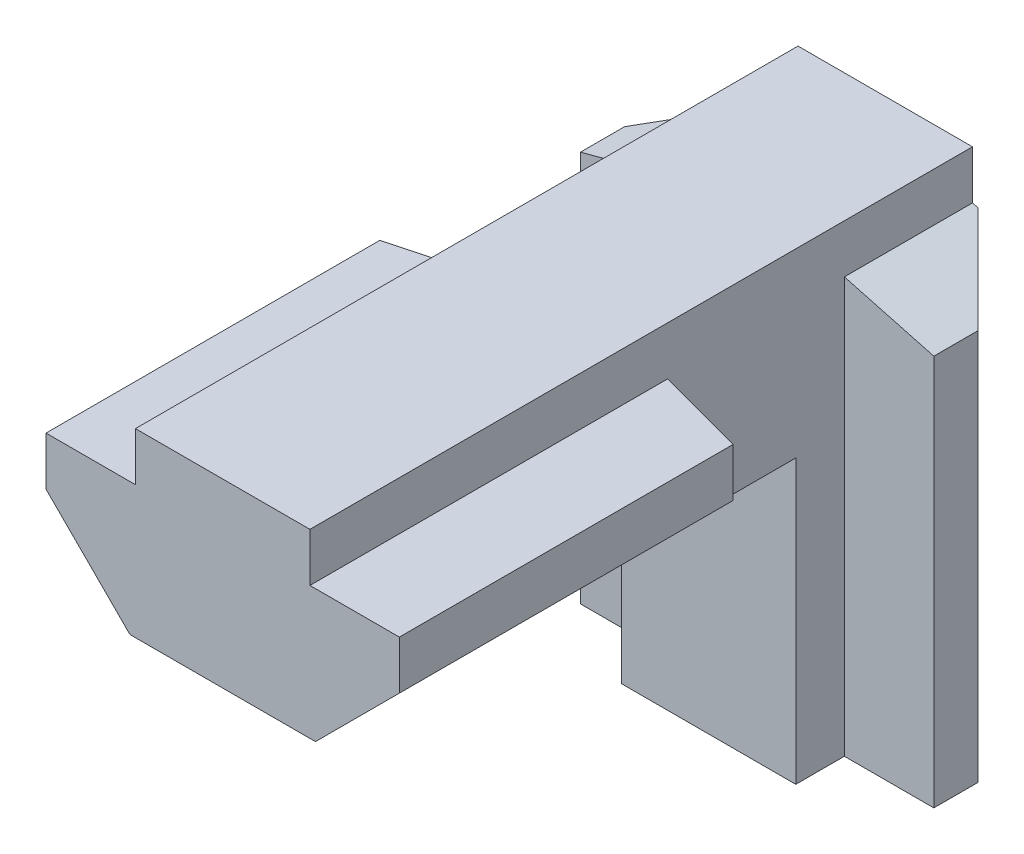
ISO-10303-21;
HEADER;
FILE_DESCRIPTION(('STEP AP214'),'2;1');
FILE_NAME('part.step','',(''),(''),'','','');
FILE_SCHEMA(('AUTOMOTIVE_DESIGN { 1 0 10303 214 1 1 1 1 }'));
ENDSEC;
DATA;
#1=APPLICATION_CONTEXT('core data for automotive mechanical design processes');
#2=APPLICATION_PROTOCOL_DEFINITION('international standard','automotive_design',2000,#1);
#3=PRODUCT_CONTEXT('',#1,'mechanical');
#4=PRODUCT('Part','Part','',(#3));
#5=PRODUCT_RELATED_PRODUCT_CATEGORY('part','',(#4));
#6=PRODUCT_DEFINITION_FORMATION('','',#4);
#7=PRODUCT_DEFINITION_CONTEXT('part definition',#1,'design');
#8=PRODUCT_DEFINITION('design','',#6,#7);
#9=PRODUCT_DEFINITION_SHAPE('','',#8);
#10=(LENGTH_UNIT() NAMED_UNIT(*) SI_UNIT(.MILLI.,.METRE.));
#11=(NAMED_UNIT(*) PLANE_ANGLE_UNIT() SI_UNIT($,.RADIAN.));
#12=(NAMED_UNIT(*) SI_UNIT($,.STERADIAN.) SOLID_ANGLE_UNIT());
#13=UNCERTAINTY_MEASURE_WITH_UNIT(LENGTH_MEASURE(1.E-05),#10,'distance_accuracy_value','');
#14=(GEOMETRIC_REPRESENTATION_CONTEXT(3) GLOBAL_UNCERTAINTY_ASSIGNED_CONTEXT((#13)) GLOBAL_UNIT_ASSIGNED_CONTEXT((#10,
#11,#12)) REPRESENTATION_CONTEXT('',''));
#15=CARTESIAN_POINT('',(0.,0.,0.));
#16=DIRECTION('',(0.,0.,1.));
#17=DIRECTION('',(1.,0.,0.));
#18=AXIS2_PLACEMENT_3D('',#15,#16,#17);
#19=CARTESIAN_POINT('',(8.,0.,0.));
#20=DIRECTION('',(1.,0.,0.));
#21=DIRECTION('',(0.,0.,-1.));
#22=AXIS2_PLACEMENT_3D('',#19,#20,#21);
#23=PLANE('',#22);
#24=DIRECTION('',(0.,1.,0.));
#25=VECTOR('',#24,1.);
#26=CARTESIAN_POINT('',(8.,-21.,-4.2));
#27=LINE('',#26,#25);
#28=CARTESIAN_POINT('',(8.,-21.,-4.2));
#29=VERTEX_POINT('',#28);
#30=CARTESIAN_POINT('',(8.,-3.285194229346,-4.2));
#31=VERTEX_POINT('',#30);
#32=EDGE_CURVE('E276',#29,#31,#27,.T.);
#33=ORIENTED_EDGE('',*,*,#32,.T.);
#34=DIRECTION('',(0.,0.,1.));
#35=VECTOR('',#34,1.);
#36=CARTESIAN_POINT('',(8.,-3.285194229346,-8.));
#37=LINE('',#36,#35);
#38=CARTESIAN_POINT('',(8.,-3.285194229346,-2.2));
#39=VERTEX_POINT('',#38);
#40=EDGE_CURVE('E244',#31,#39,#37,.T.);
#41=ORIENTED_EDGE('',*,*,#40,.T.);
#42=DIRECTION('',(0.,1.,0.));
#43=VECTOR('',#42,1.);
#44=CARTESIAN_POINT('',(8.,-21.,-2.2));
#45=LINE('',#44,#43);
#46=CARTESIAN_POINT('',(8.,-21.,-2.2));
#47=VERTEX_POINT('',#46);
#48=EDGE_CURVE('E249',#39,#47,#45,.F.);
#49=ORIENTED_EDGE('',*,*,#48,.T.);
#50=DIRECTION('',(0.,0.,-1.));
#51=VECTOR('',#50,1.);
#52=CARTESIAN_POINT('',(8.,-21.,0.));
#53=LINE('',#52,#51);
#54=EDGE_CURVE('E288',#29,#47,#53,.F.);
#55=ORIENTED_EDGE('',*,*,#54,.F.);
#56=EDGE_LOOP('',(#33,#41,#49,#55));
#57=FACE_BOUND('',#56,.T.);
#58=ADVANCED_FACE('F15',(#57),#23,.T.);
#59=CARTESIAN_POINT('',(-8.,0.,0.));
#60=DIRECTION('',(1.,0.,0.));
#61=DIRECTION('',(0.,0.,-1.));
#62=AXIS2_PLACEMENT_3D('',#59,#60,#61);
#63=PLANE('',#62);
#64=DIRECTION('',(0.,1.,0.));
#65=VECTOR('',#64,1.);
#66=CARTESIAN_POINT('',(-8.,-21.,-2.2));
#67=LINE('',#66,#65);
#68=CARTESIAN_POINT('',(-8.,-21.,-2.2));
#69=VERTEX_POINT('',#68);
#70=CARTESIAN_POINT('',(-8.00000000000001,-3.28519422934598,-2.2));
#71=VERTEX_POINT('',#70);
#72=EDGE_CURVE('E214',#69,#71,#67,.T.);
#73=ORIENTED_EDGE('',*,*,#72,.T.);
#74=DIRECTION('',(0.,0.,1.));
#75=VECTOR('',#74,1.);
#76=CARTESIAN_POINT('',(-8.00000000000002,-3.28519422934593,-8.));
#77=LINE('',#76,#75);
#78=CARTESIAN_POINT('',(-8.00000000000001,-3.28519422934598,-4.2));
#79=VERTEX_POINT('',#78);
#80=EDGE_CURVE('E181',#71,#79,#77,.F.);
#81=ORIENTED_EDGE('',*,*,#80,.T.);
#82=DIRECTION('',(0.,1.,0.));
#83=VECTOR('',#82,1.);
#84=CARTESIAN_POINT('',(-8.,-21.,-4.2));
#85=LINE('',#84,#83);
#86=CARTESIAN_POINT('',(-8.,-21.,-4.2));
#87=VERTEX_POINT('',#86);
#88=EDGE_CURVE('E177',#79,#87,#85,.F.);
#89=ORIENTED_EDGE('',*,*,#88,.T.);
#90=DIRECTION('',(0.,0.,-1.));
#91=VECTOR('',#90,1.);
#92=CARTESIAN_POINT('',(-8.,-21.,0.));
#93=LINE('',#92,#91);
#94=EDGE_CURVE('E217',#69,#87,#93,.T.);
#95=ORIENTED_EDGE('',*,*,#94,.F.);
#96=EDGE_LOOP('',(#73,#81,#89,#95));
#97=FACE_BOUND('',#96,.T.);
#98=ADVANCED_FACE('F216',(#97),#63,.F.);
#99=CARTESIAN_POINT('',(-8.,-21.,-2.2));
#100=DIRECTION('',(0.,0.,-1.));
#101=DIRECTION('',(-1.,0.,0.));
#102=AXIS2_PLACEMENT_3D('',#99,#100,#101);
#103=PLANE('',#102);
#104=DIRECTION('',(0.,1.,0.));
#105=VECTOR('',#104,1.);
#106=CARTESIAN_POINT('',(-3.95,-2.2,-2.2));
#107=LINE('',#106,#105);
#108=CARTESIAN_POINT('',(-3.95,-21.,-2.2));
#109=VERTEX_POINT('',#108);
#110=CARTESIAN_POINT('',(-3.95,-2.2,-2.2));
#111=VERTEX_POINT('',#110);
#112=EDGE_CURVE('E223',#109,#111,#107,.T.);
#113=ORIENTED_EDGE('',*,*,#112,.T.);
#114=DIRECTION('',(0.965925826289076,0.258819045102493,0.));
#115=VECTOR('',#114,1.);
#116=CARTESIAN_POINT('',(-3.95,-2.2,-2.2));
#117=LINE('',#116,#115);
#118=EDGE_CURVE('E220',#111,#71,#117,.F.);
#119=ORIENTED_EDGE('',*,*,#118,.T.);
#120=ORIENTED_EDGE('',*,*,#72,.F.);
#121=DIRECTION('',(1.,0.,0.));
#122=VECTOR('',#121,1.);
#123=CARTESIAN_POINT('',(-8.,-21.,-2.2));
#124=LINE('',#123,#122);
#125=EDGE_CURVE('E169',#109,#69,#124,.F.);
#126=ORIENTED_EDGE('',*,*,#125,.F.);
#127=EDGE_LOOP('',(#113,#119,#120,#126));
#128=FACE_BOUND('',#127,.T.);
#129=ADVANCED_FACE('F221',(#128),#103,.F.);
#130=CARTESIAN_POINT('',(-3.95,-2.2,-8.));
#131=DIRECTION('',(0.258819045102493,-0.965925826289076,0.));
#132=DIRECTION('',(0.965925826289076,0.258819045102493,0.));
#133=AXIS2_PLACEMENT_3D('',#130,#131,#132);
#134=PLANE('',#133);
#135=DIRECTION('',(0.,0.,-1.));
#136=VECTOR('',#135,1.);
#137=CARTESIAN_POINT('',(-3.95,-2.2,22.));
#138=LINE('',#137,#136);
#139=CARTESIAN_POINT('',(-3.95,-2.2,-8.));
#140=VERTEX_POINT('',#139);
#141=EDGE_CURVE('E306',#111,#140,#138,.T.);
#142=ORIENTED_EDGE('',*,*,#141,.T.);
#143=DIRECTION('',(0.965925826289076,0.258819045102493,0.));
#144=VECTOR('',#143,1.);
#145=CARTESIAN_POINT('',(-3.95,-2.2,-8.));
#146=LINE('',#145,#144);
#147=CARTESIAN_POINT('',(-4.20000000000003,-2.26698729810789,-8.));
#148=VERTEX_POINT('',#147);
#149=EDGE_CURVE('E76',#148,#140,#146,.T.);
#150=ORIENTED_EDGE('',*,*,#149,.F.);
#151=DIRECTION('',(-0.694746590606872,-0.186156787897339,0.694746590606872));
#152=VECTOR('',#151,1.);
#153=CARTESIAN_POINT('',(-4.2,-2.26698729810799,-8.));
#154=LINE('',#153,#152);
#155=EDGE_CURVE('E228',#148,#79,#154,.T.);
#156=ORIENTED_EDGE('',*,*,#155,.T.);
#157=ORIENTED_EDGE('',*,*,#80,.F.);
#158=ORIENTED_EDGE('',*,*,#118,.F.);
#159=EDGE_LOOP('',(#142,#150,#156,#157,#158));
#160=FACE_BOUND('',#159,.T.);
#161=ADVANCED_FACE('F227',(#160),#134,.F.);
#162=CARTESIAN_POINT('',(-3.95,-21.,5.8));
#163=DIRECTION('',(0.258819045102493,0.,0.965925826289076));
#164=DIRECTION('',(0.965925826289076,0.,-0.258819045102493));
#165=AXIS2_PLACEMENT_3D('',#162,#163,#164);
#166=PLANE('',#165);
#167=DIRECTION('',(0.,1.,0.));
#168=VECTOR('',#167,1.);
#169=CARTESIAN_POINT('',(-3.95,-2.2,5.8));
#170=LINE('',#169,#168);
#171=CARTESIAN_POINT('',(-3.95,-2.2,5.8));
#172=VERTEX_POINT('',#171);
#173=CARTESIAN_POINT('',(-3.95,-8.19999999999999,5.8));
#174=VERTEX_POINT('',#173);
#175=EDGE_CURVE('E302',#172,#174,#170,.F.);
#176=ORIENTED_EDGE('',*,*,#175,.T.);
#177=DIRECTION('',(0.965925826288855,0.,-0.258819045103315));
#178=VECTOR('',#177,1.);
#179=CARTESIAN_POINT('',(-4.2,-8.2,5.866987298108));
#180=LINE('',#179,#178);
#181=CARTESIAN_POINT('',(-4.20000000000003,-8.2,5.86698729810789));
#182=VERTEX_POINT('',#181);
#183=EDGE_CURVE('E251',#182,#174,#180,.T.);
#184=ORIENTED_EDGE('',*,*,#183,.F.);
#185=DIRECTION('',(-0.694746590606872,0.694746590606872,0.186156787897339));
#186=VECTOR('',#185,1.);
#187=CARTESIAN_POINT('',(-4.2,-8.2,5.86698729810799));
#188=LINE('',#187,#186);
#189=CARTESIAN_POINT('',(-8.00000000000001,-4.4,6.88519422934598));
#190=VERTEX_POINT('',#189);
#191=EDGE_CURVE('E238',#182,#190,#188,.T.);
#192=ORIENTED_EDGE('',*,*,#191,.T.);
#193=DIRECTION('',(0.,1.,0.));
#194=VECTOR('',#193,1.);
#195=CARTESIAN_POINT('',(-8.,0.,6.885194229346));
#196=LINE('',#195,#194);
#197=CARTESIAN_POINT('',(-8.00000000000001,-2.2,6.88519422934597));
#198=VERTEX_POINT('',#197);
#199=EDGE_CURVE('E233',#190,#198,#196,.T.);
#200=ORIENTED_EDGE('',*,*,#199,.T.);
#201=DIRECTION('',(0.965925826289071,0.,-0.258819045102511));
#202=VECTOR('',#201,1.);
#203=CARTESIAN_POINT('',(-8.,-2.2,6.885194229346));
#204=LINE('',#203,#202);
#205=EDGE_CURVE('E225',#198,#172,#204,.T.);
#206=ORIENTED_EDGE('',*,*,#205,.T.);
#207=EDGE_LOOP('',(#176,#184,#192,#200,#206));
#208=FACE_BOUND('',#207,.T.);
#209=ADVANCED_FACE('F396',(#208),#166,.F.);
#210=CARTESIAN_POINT('',(-8.,-2.2,22.));
#211=DIRECTION('',(0.,-1.,0.));
#212=DIRECTION('',(0.,0.,-1.));
#213=AXIS2_PLACEMENT_3D('',#210,#211,#212);
#214=PLANE('',#213);
#215=DIRECTION('',(1.,0.,0.));
#216=VECTOR('',#215,1.);
#217=CARTESIAN_POINT('',(-8.,-2.2,22.));
#218=LINE('',#217,#216);
#219=CARTESIAN_POINT('',(-3.95,-2.2,22.));
#220=VERTEX_POINT('',#219);
#221=CARTESIAN_POINT('',(-8.,-2.2,22.));
#222=VERTEX_POINT('',#221);
#223=EDGE_CURVE('E143',#220,#222,#218,.F.);
#224=ORIENTED_EDGE('',*,*,#223,.F.);
#225=DIRECTION('',(0.,0.,-1.));
#226=VECTOR('',#225,1.);
#227=CARTESIAN_POINT('',(-3.95,-2.2,22.));
#228=LINE('',#227,#226);
#229=EDGE_CURVE('E304',#220,#172,#228,.T.);
#230=ORIENTED_EDGE('',*,*,#229,.T.);
#231=ORIENTED_EDGE('',*,*,#205,.F.);
#232=DIRECTION('',(0.,0.,-1.));
#233=VECTOR('',#232,1.);
#234=CARTESIAN_POINT('',(-8.,-2.2,0.));
#235=LINE('',#234,#233);
#236=EDGE_CURVE('E234',#198,#222,#235,.F.);
#237=ORIENTED_EDGE('',*,*,#236,.T.);
#238=EDGE_LOOP('',(#224,#230,#231,#237));
#239=FACE_BOUND('',#238,.T.);
#240=ADVANCED_FACE('F399',(#239),#214,.F.);
#241=CARTESIAN_POINT('',(-8.,0.,0.));
#242=DIRECTION('',(1.,0.,0.));
#243=DIRECTION('',(0.,0.,-1.));
#244=AXIS2_PLACEMENT_3D('',#241,#242,#243);
#245=PLANE('',#244);
#246=ORIENTED_EDGE('',*,*,#236,.F.);
#247=ORIENTED_EDGE('',*,*,#199,.F.);
#248=DIRECTION('',(0.,0.,1.));
#249=VECTOR('',#248,1.);
#250=CARTESIAN_POINT('',(-8.,-4.4,22.));
#251=LINE('',#250,#249);
#252=CARTESIAN_POINT('',(-8.,-4.4,22.));
#253=VERTEX_POINT('',#252);
#254=EDGE_CURVE('E236',#190,#253,#251,.T.);
#255=ORIENTED_EDGE('',*,*,#254,.T.);
#256=DIRECTION('',(0.,1.,0.));
#257=VECTOR('',#256,1.);
#258=CARTESIAN_POINT('',(-8.,0.,22.));
#259=LINE('',#258,#257);
#260=EDGE_CURVE('E326',#222,#253,#259,.F.);
#261=ORIENTED_EDGE('',*,*,#260,.F.);
#262=EDGE_LOOP('',(#246,#247,#255,#261));
#263=FACE_BOUND('',#262,.T.);
#264=ADVANCED_FACE('F402',(#263),#245,.F.);
#265=CARTESIAN_POINT('',(-4.2,-8.2,22.));
#266=DIRECTION('',(0.707106781186548,0.707106781186548,0.));
#267=DIRECTION('',(-0.707106781186548,0.707106781186548,0.));
#268=AXIS2_PLACEMENT_3D('',#265,#266,#267);
#269=PLANE('',#268);
#270=DIRECTION('',(0.,0.,-1.));
#271=VECTOR('',#270,1.);
#272=CARTESIAN_POINT('',(-4.2,-8.2,22.));
#273=LINE('',#272,#271);
#274=CARTESIAN_POINT('',(-4.2,-8.2,22.));
#275=VERTEX_POINT('',#274);
#276=EDGE_CURVE('E253',#275,#182,#273,.T.);
#277=ORIENTED_EDGE('',*,*,#276,.F.);
#278=DIRECTION('',(0.707106781186548,-0.707106781186547,0.));
#279=VECTOR('',#278,1.);
#280=CARTESIAN_POINT('',(-8.,-4.4,22.));
#281=LINE('',#280,#279);
#282=EDGE_CURVE('E323',#253,#275,#281,.T.);
#283=ORIENTED_EDGE('',*,*,#282,.F.);
#284=ORIENTED_EDGE('',*,*,#254,.F.);
#285=ORIENTED_EDGE('',*,*,#191,.F.);
#286=EDGE_LOOP('',(#277,#283,#284,#285));
#287=FACE_BOUND('',#286,.T.);
#288=ADVANCED_FACE('F393',(#287),#269,.F.);
#289=CARTESIAN_POINT('',(8.,-4.4,22.));
#290=DIRECTION('',(-0.707106781186548,0.707106781186548,0.));
#291=DIRECTION('',(-0.707106781186548,-0.707106781186548,0.));
#292=AXIS2_PLACEMENT_3D('',#289,#290,#291);
#293=PLANE('',#292);
#294=DIRECTION('',(0.,0.,-1.));
#295=VECTOR('',#294,1.);
#296=CARTESIAN_POINT('',(4.2,-8.2,22.));
#297=LINE('',#296,#295);
#298=CARTESIAN_POINT('',(4.20000000000001,-8.2,5.86698729810796));
#299=VERTEX_POINT('',#298);
#300=CARTESIAN_POINT('',(4.2,-8.2,22.));
#301=VERTEX_POINT('',#300);
#302=EDGE_CURVE('E257',#299,#301,#297,.F.);
#303=ORIENTED_EDGE('',*,*,#302,.F.);
#304=DIRECTION('',(0.694746590606865,0.694746590606872,0.186156787897364));
#305=VECTOR('',#304,1.);
#306=CARTESIAN_POINT('',(4.20000000000004,-8.19999999999999,5.86698729810786));
#307=LINE('',#306,#305);
#308=CARTESIAN_POINT('',(8.,-4.4,6.885194229346));
#309=VERTEX_POINT('',#308);
#310=EDGE_CURVE('E264',#299,#309,#307,.T.);
#311=ORIENTED_EDGE('',*,*,#310,.T.);
#312=DIRECTION('',(0.,0.,-1.));
#313=VECTOR('',#312,1.);
#314=CARTESIAN_POINT('',(8.,-4.4,0.));
#315=LINE('',#314,#313);
#316=CARTESIAN_POINT('',(8.,-4.4,22.));
#317=VERTEX_POINT('',#316);
#318=EDGE_CURVE('E241',#317,#309,#315,.T.);
#319=ORIENTED_EDGE('',*,*,#318,.F.);
#320=DIRECTION('',(0.707106781186548,0.707106781186547,0.));
#321=VECTOR('',#320,1.);
#322=CARTESIAN_POINT('',(4.2,-8.2,22.));
#323=LINE('',#322,#321);
#324=EDGE_CURVE('E317',#301,#317,#323,.T.);
#325=ORIENTED_EDGE('',*,*,#324,.F.);
#326=EDGE_LOOP('',(#303,#311,#319,#325));
#327=FACE_BOUND('',#326,.T.);
#328=ADVANCED_FACE('F388',(#327),#293,.F.);
#329=CARTESIAN_POINT('',(8.,0.,0.));
#330=DIRECTION('',(1.,0.,0.));
#331=DIRECTION('',(0.,0.,-1.));
#332=AXIS2_PLACEMENT_3D('',#329,#330,#331);
#333=PLANE('',#332);
#334=DIRECTION('',(0.,1.,0.));
#335=VECTOR('',#334,1.);
#336=CARTESIAN_POINT('',(8.,0.,22.));
#337=LINE('',#336,#335);
#338=CARTESIAN_POINT('',(8.,-2.2,22.));
#339=VERTEX_POINT('',#338);
#340=EDGE_CURVE('E314',#317,#339,#337,.T.);
#341=ORIENTED_EDGE('',*,*,#340,.F.);
#342=ORIENTED_EDGE('',*,*,#318,.T.);
#343=DIRECTION('',(0.,1.,0.));
#344=VECTOR('',#343,1.);
#345=CARTESIAN_POINT('',(8.,-21.,6.885194229346));
#346=LINE('',#345,#344);
#347=CARTESIAN_POINT('',(8.,-2.2,6.885194229346));
#348=VERTEX_POINT('',#347);
#349=EDGE_CURVE('E256',#309,#348,#346,.T.);
#350=ORIENTED_EDGE('',*,*,#349,.T.);
#351=DIRECTION('',(0.,0.,-1.));
#352=VECTOR('',#351,1.);
#353=CARTESIAN_POINT('',(8.,-2.2,22.));
#354=LINE('',#353,#352);
#355=EDGE_CURVE('E121',#348,#339,#354,.F.);
#356=ORIENTED_EDGE('',*,*,#355,.T.);
#357=EDGE_LOOP('',(#341,#342,#350,#356));
#358=FACE_BOUND('',#357,.T.);
#359=ADVANCED_FACE('F386',(#358),#333,.T.);
#360=CARTESIAN_POINT('',(8.,-3.285194229346,-8.));
#361=DIRECTION('',(-0.258819045102493,-0.965925826289076,0.));
#362=DIRECTION('',(0.965925826289076,-0.258819045102493,0.));
#363=AXIS2_PLACEMENT_3D('',#360,#361,#362);
#364=PLANE('',#363);
#365=DIRECTION('',(0.965925826289076,-0.258819045102493,0.));
#366=VECTOR('',#365,1.);
#367=CARTESIAN_POINT('',(8.,-3.285194229346,-8.));
#368=LINE('',#367,#366);
#369=CARTESIAN_POINT('',(3.94999999999999,-2.20000000000003,-8.));
#370=VERTEX_POINT('',#369);
#371=CARTESIAN_POINT('',(4.20000000000002,-2.26698729810793,-8.));
#372=VERTEX_POINT('',#371);
#373=EDGE_CURVE('E245',#370,#372,#368,.T.);
#374=ORIENTED_EDGE('',*,*,#373,.F.);
#375=DIRECTION('',(0.,0.,1.));
#376=VECTOR('',#375,1.);
#377=CARTESIAN_POINT('',(3.95,-2.2,22.));
#378=LINE('',#377,#376);
#379=CARTESIAN_POINT('',(3.94999999999999,-2.20000000000004,-2.2));
#380=VERTEX_POINT('',#379);
#381=EDGE_CURVE('E113',#370,#380,#378,.T.);
#382=ORIENTED_EDGE('',*,*,#381,.T.);
#383=DIRECTION('',(0.965925826289071,-0.25881904510251,0.));
#384=VECTOR('',#383,1.);
#385=CARTESIAN_POINT('',(3.95,-2.2,-2.2));
#386=LINE('',#385,#384);
#387=EDGE_CURVE('E247',#380,#39,#386,.T.);
#388=ORIENTED_EDGE('',*,*,#387,.T.);
#389=ORIENTED_EDGE('',*,*,#40,.F.);
#390=DIRECTION('',(-0.694746590606872,0.186156787897339,-0.694746590606872));
#391=VECTOR('',#390,1.);
#392=CARTESIAN_POINT('',(8.,-3.28519422934599,-4.2));
#393=LINE('',#392,#391);
#394=EDGE_CURVE('E273',#31,#372,#393,.T.);
#395=ORIENTED_EDGE('',*,*,#394,.T.);
#396=EDGE_LOOP('',(#374,#382,#388,#389,#395));
#397=FACE_BOUND('',#396,.T.);
#398=ADVANCED_FACE('F446',(#397),#364,.F.);
#399=CARTESIAN_POINT('',(3.95,-21.,-2.2));
#400=DIRECTION('',(0.,0.,-1.));
#401=DIRECTION('',(-1.,0.,0.));
#402=AXIS2_PLACEMENT_3D('',#399,#400,#401);
#403=PLANE('',#402);
#404=DIRECTION('',(1.,0.,0.));
#405=VECTOR('',#404,1.);
#406=CARTESIAN_POINT('',(-8.,-21.,-2.2));
#407=LINE('',#406,#405);
#408=CARTESIAN_POINT('',(3.95,-21.,-2.2));
#409=VERTEX_POINT('',#408);
#410=EDGE_CURVE('E286',#47,#409,#407,.F.);
#411=ORIENTED_EDGE('',*,*,#410,.F.);
#412=ORIENTED_EDGE('',*,*,#48,.F.);
#413=ORIENTED_EDGE('',*,*,#387,.F.);
#414=DIRECTION('',(0.,1.,0.));
#415=VECTOR('',#414,1.);
#416=CARTESIAN_POINT('',(3.95,0.,-2.2));
#417=LINE('',#416,#415);
#418=EDGE_CURVE('E107',#380,#409,#417,.F.);
#419=ORIENTED_EDGE('',*,*,#418,.T.);
#420=EDGE_LOOP('',(#411,#412,#413,#419));
#421=FACE_BOUND('',#420,.T.);
#422=ADVANCED_FACE('F443',(#421),#403,.F.);
#423=CARTESIAN_POINT('',(-8.,-8.2,0.));
#424=DIRECTION('',(0.,0.,1.));
#425=DIRECTION('',(1.,0.,0.));
#426=AXIS2_PLACEMENT_3D('',#423,#424,#425);
#427=PLANE('',#426);
#428=DIRECTION('',(0.,1.,0.));
#429=VECTOR('',#428,1.);
#430=CARTESIAN_POINT('',(-3.95,-2.2,0.));
#431=LINE('',#430,#429);
#432=CARTESIAN_POINT('',(-3.95,-8.2,0.));
#433=VERTEX_POINT('',#432);
#434=CARTESIAN_POINT('',(-3.95,-21.,0.));
#435=VERTEX_POINT('',#434);
#436=EDGE_CURVE('E151',#433,#435,#431,.F.);
#437=ORIENTED_EDGE('',*,*,#436,.T.);
#438=DIRECTION('',(1.,0.,0.));
#439=VECTOR('',#438,1.);
#440=CARTESIAN_POINT('',(-8.,-21.,0.));
#441=LINE('',#440,#439);
#442=CARTESIAN_POINT('',(3.95,-21.,0.));
#443=VERTEX_POINT('',#442);
#444=EDGE_CURVE('E284',#443,#435,#441,.F.);
#445=ORIENTED_EDGE('',*,*,#444,.F.);
#446=DIRECTION('',(0.,1.,0.));
#447=VECTOR('',#446,1.);
#448=CARTESIAN_POINT('',(3.95,0.,0.));
#449=LINE('',#448,#447);
#450=CARTESIAN_POINT('',(3.95,-8.2,0.));
#451=VERTEX_POINT('',#450);
#452=EDGE_CURVE('E338',#443,#451,#449,.T.);
#453=ORIENTED_EDGE('',*,*,#452,.T.);
#454=DIRECTION('',(1.,0.,0.));
#455=VECTOR('',#454,1.);
#456=CARTESIAN_POINT('',(-8.,-8.2,0.));
#457=LINE('',#456,#455);
#458=EDGE_CURVE('E259',#433,#451,#457,.T.);
#459=ORIENTED_EDGE('',*,*,#458,.F.);
#460=EDGE_LOOP('',(#437,#445,#453,#459));
#461=FACE_BOUND('',#460,.T.);
#462=ADVANCED_FACE('F369',(#461),#427,.T.);
#463=CARTESIAN_POINT('',(-8.,-8.2,22.));
#464=DIRECTION('',(0.,-1.,0.));
#465=DIRECTION('',(0.,0.,-1.));
#466=AXIS2_PLACEMENT_3D('',#463,#464,#465);
#467=PLANE('',#466);
#468=DIRECTION('',(1.,0.,0.));
#469=VECTOR('',#468,1.);
#470=CARTESIAN_POINT('',(-8.,-8.2,22.));
#471=LINE('',#470,#469);
#472=EDGE_CURVE('E320',#275,#301,#471,.T.);
#473=ORIENTED_EDGE('',*,*,#472,.F.);
#474=ORIENTED_EDGE('',*,*,#276,.T.);
#475=ORIENTED_EDGE('',*,*,#183,.T.);
#476=DIRECTION('',(0.,0.,-1.));
#477=VECTOR('',#476,1.);
#478=CARTESIAN_POINT('',(-3.95,-8.2,22.));
#479=LINE('',#478,#477);
#480=EDGE_CURVE('E299',#174,#433,#479,.T.);
#481=ORIENTED_EDGE('',*,*,#480,.T.);
#482=ORIENTED_EDGE('',*,*,#458,.T.);
#483=DIRECTION('',(0.,0.,1.));
#484=VECTOR('',#483,1.);
#485=CARTESIAN_POINT('',(3.95,-8.2,22.));
#486=LINE('',#485,#484);
#487=CARTESIAN_POINT('',(3.95,-8.2,5.80000000000001));
#488=VERTEX_POINT('',#487);
#489=EDGE_CURVE('E336',#451,#488,#486,.T.);
#490=ORIENTED_EDGE('',*,*,#489,.T.);
#491=DIRECTION('',(0.965925826289076,0.,0.258819045102493));
#492=VECTOR('',#491,1.);
#493=CARTESIAN_POINT('',(8.,-8.19999999999999,6.885194229346));
#494=LINE('',#493,#492);
#495=EDGE_CURVE('E268',#488,#299,#494,.T.);
#496=ORIENTED_EDGE('',*,*,#495,.T.);
#497=ORIENTED_EDGE('',*,*,#302,.T.);
#498=EDGE_LOOP('',(#473,#474,#475,#481,#482,#490,#496,#497));
#499=FACE_BOUND('',#498,.T.);
#500=ADVANCED_FACE('F373',(#499),#467,.T.);
#501=CARTESIAN_POINT('',(8.,-21.,6.885194229346));
#502=DIRECTION('',(-0.258819045102493,0.,0.965925826289076));
#503=DIRECTION('',(0.965925826289076,0.,0.258819045102493));
#504=AXIS2_PLACEMENT_3D('',#501,#502,#503);
#505=PLANE('',#504);
#506=ORIENTED_EDGE('',*,*,#495,.F.);
#507=DIRECTION('',(0.,1.,0.));
#508=VECTOR('',#507,1.);
#509=CARTESIAN_POINT('',(3.95,0.,5.8));
#510=LINE('',#509,#508);
#511=CARTESIAN_POINT('',(3.94999999999999,-2.2,5.80000000000004));
#512=VERTEX_POINT('',#511);
#513=EDGE_CURVE('E334',#488,#512,#510,.T.);
#514=ORIENTED_EDGE('',*,*,#513,.T.);
#515=DIRECTION('',(0.965925826289071,0.,0.258819045102511));
#516=VECTOR('',#515,1.);
#517=CARTESIAN_POINT('',(3.95,-2.2,5.8));
#518=LINE('',#517,#516);
#519=EDGE_CURVE('E267',#512,#348,#518,.T.);
#520=ORIENTED_EDGE('',*,*,#519,.T.);
#521=ORIENTED_EDGE('',*,*,#349,.F.);
#522=ORIENTED_EDGE('',*,*,#310,.F.);
#523=EDGE_LOOP('',(#506,#514,#520,#521,#522));
#524=FACE_BOUND('',#523,.T.);
#525=ADVANCED_FACE('F379',(#524),#505,.F.);
#526=CARTESIAN_POINT('',(3.95,-2.2,22.));
#527=DIRECTION('',(0.,-1.,0.));
#528=DIRECTION('',(0.,0.,-1.));
#529=AXIS2_PLACEMENT_3D('',#526,#527,#528);
#530=PLANE('',#529);
#531=DIRECTION('',(1.,0.,0.));
#532=VECTOR('',#531,1.);
#533=CARTESIAN_POINT('',(-8.,-2.2,22.));
#534=LINE('',#533,#532);
#535=CARTESIAN_POINT('',(3.95,-2.2,22.));
#536=VERTEX_POINT('',#535);
#537=EDGE_CURVE('E312',#339,#536,#534,.F.);
#538=ORIENTED_EDGE('',*,*,#537,.F.);
#539=ORIENTED_EDGE('',*,*,#355,.F.);
#540=ORIENTED_EDGE('',*,*,#519,.F.);
#541=DIRECTION('',(0.,0.,1.));
#542=VECTOR('',#541,1.);
#543=CARTESIAN_POINT('',(3.95,-2.2,22.));
#544=LINE('',#543,#542);
#545=EDGE_CURVE('E85',#512,#536,#544,.T.);
#546=ORIENTED_EDGE('',*,*,#545,.T.);
#547=EDGE_LOOP('',(#538,#539,#540,#546));
#548=FACE_BOUND('',#547,.T.);
#549=ADVANCED_FACE('F382',(#548),#530,.F.);
#550=CARTESIAN_POINT('',(8.,-21.,-4.2));
#551=DIRECTION('',(-0.707106781186548,0.,0.707106781186548));
#552=DIRECTION('',(0.707106781186548,0.,0.707106781186548));
#553=AXIS2_PLACEMENT_3D('',#550,#551,#552);
#554=PLANE('',#553);
#555=DIRECTION('',(0.707106781186547,0.,0.707106781186547));
#556=VECTOR('',#555,1.);
#557=CARTESIAN_POINT('',(4.2,-21.,-8.));
#558=LINE('',#557,#556);
#559=CARTESIAN_POINT('',(4.2,-21.,-8.));
#560=VERTEX_POINT('',#559);
#561=EDGE_CURVE('E279',#560,#29,#558,.T.);
#562=ORIENTED_EDGE('',*,*,#561,.F.);
#563=DIRECTION('',(0.,1.,0.));
#564=VECTOR('',#563,1.);
#565=CARTESIAN_POINT('',(4.2,-21.,-8.));
#566=LINE('',#565,#564);
#567=EDGE_CURVE('E351',#372,#560,#566,.F.);
#568=ORIENTED_EDGE('',*,*,#567,.F.);
#569=ORIENTED_EDGE('',*,*,#394,.F.);
#570=ORIENTED_EDGE('',*,*,#32,.F.);
#571=EDGE_LOOP('',(#562,#568,#569,#570));
#572=FACE_BOUND('',#571,.T.);
#573=ADVANCED_FACE('F431',(#572),#554,.F.);
#574=CARTESIAN_POINT('',(-8.,-21.,0.));
#575=DIRECTION('',(0.,-1.,0.));
#576=DIRECTION('',(0.,0.,-1.));
#577=AXIS2_PLACEMENT_3D('',#574,#575,#576);
#578=PLANE('',#577);
#579=ORIENTED_EDGE('',*,*,#94,.T.);
#580=DIRECTION('',(0.707106781186548,0.,-0.707106781186548));
#581=VECTOR('',#580,1.);
#582=CARTESIAN_POINT('',(-4.2,-21.,-8.));
#583=LINE('',#582,#581);
#584=CARTESIAN_POINT('',(-4.2,-21.,-8.));
#585=VERTEX_POINT('',#584);
#586=EDGE_CURVE('E56',#87,#585,#583,.T.);
#587=ORIENTED_EDGE('',*,*,#586,.T.);
#588=DIRECTION('',(-1.,0.,0.));
#589=VECTOR('',#588,1.);
#590=CARTESIAN_POINT('',(-8.,-21.,-8.));
#591=LINE('',#590,#589);
#592=EDGE_CURVE('E348',#560,#585,#591,.T.);
#593=ORIENTED_EDGE('',*,*,#592,.F.);
#594=ORIENTED_EDGE('',*,*,#561,.T.);
#595=ORIENTED_EDGE('',*,*,#54,.T.);
#596=ORIENTED_EDGE('',*,*,#410,.T.);
#597=DIRECTION('',(0.,0.,1.));
#598=VECTOR('',#597,1.);
#599=CARTESIAN_POINT('',(3.95,-21.,22.));
#600=LINE('',#599,#598);
#601=EDGE_CURVE('E340',#409,#443,#600,.T.);
#602=ORIENTED_EDGE('',*,*,#601,.T.);
#603=ORIENTED_EDGE('',*,*,#444,.T.);
#604=DIRECTION('',(0.,0.,-1.));
#605=VECTOR('',#604,1.);
#606=CARTESIAN_POINT('',(-3.95,-21.,22.));
#607=LINE('',#606,#605);
#608=EDGE_CURVE('E296',#435,#109,#607,.T.);
#609=ORIENTED_EDGE('',*,*,#608,.T.);
#610=ORIENTED_EDGE('',*,*,#125,.T.);
#611=EDGE_LOOP('',(#579,#587,#593,#594,#595,#596,#602,#603,#609,#610));
#612=FACE_BOUND('',#611,.T.);
#613=ADVANCED_FACE('F366',(#612),#578,.T.);
#614=CARTESIAN_POINT('',(-4.2,-21.,-8.));
#615=DIRECTION('',(0.707106781186548,0.,0.707106781186548));
#616=DIRECTION('',(0.707106781186548,0.,-0.707106781186548));
#617=AXIS2_PLACEMENT_3D('',#614,#615,#616);
#618=PLANE('',#617);
#619=DIRECTION('',(0.,1.,0.));
#620=VECTOR('',#619,1.);
#621=CARTESIAN_POINT('',(-4.2,-21.,-8.));
#622=LINE('',#621,#620);
#623=EDGE_CURVE('E345',#585,#148,#622,.T.);
#624=ORIENTED_EDGE('',*,*,#623,.F.);
#625=ORIENTED_EDGE('',*,*,#586,.F.);
#626=ORIENTED_EDGE('',*,*,#88,.F.);
#627=ORIENTED_EDGE('',*,*,#155,.F.);
#628=EDGE_LOOP('',(#624,#625,#626,#627));
#629=FACE_BOUND('',#628,.T.);
#630=ADVANCED_FACE('F425',(#629),#618,.F.);
#631=CARTESIAN_POINT('',(-3.95,-2.2,22.));
#632=DIRECTION('',(1.,0.,0.));
#633=DIRECTION('',(0.,0.,-1.));
#634=AXIS2_PLACEMENT_3D('',#631,#632,#633);
#635=PLANE('',#634);
#636=ORIENTED_EDGE('',*,*,#436,.F.);
#637=ORIENTED_EDGE('',*,*,#480,.F.);
#638=ORIENTED_EDGE('',*,*,#175,.F.);
#639=ORIENTED_EDGE('',*,*,#229,.F.);
#640=DIRECTION('',(0.,1.,0.));
#641=VECTOR('',#640,1.);
#642=CARTESIAN_POINT('',(-3.95,0.,22.));
#643=LINE('',#642,#641);
#644=CARTESIAN_POINT('',(-3.95,0.,22.));
#645=VERTEX_POINT('',#644);
#646=EDGE_CURVE('E309',#645,#220,#643,.F.);
#647=ORIENTED_EDGE('',*,*,#646,.F.);
#648=DIRECTION('',(0.,0.,1.));
#649=VECTOR('',#648,1.);
#650=CARTESIAN_POINT('',(-3.95,0.,-8.));
#651=LINE('',#650,#649);
#652=CARTESIAN_POINT('',(-3.95,0.,-8.));
#653=VERTEX_POINT('',#652);
#654=EDGE_CURVE('E19',#653,#645,#651,.T.);
#655=ORIENTED_EDGE('',*,*,#654,.F.);
#656=DIRECTION('',(0.,1.,0.));
#657=VECTOR('',#656,1.);
#658=CARTESIAN_POINT('',(-3.95,-21.,-8.));
#659=LINE('',#658,#657);
#660=EDGE_CURVE('E332',#140,#653,#659,.T.);
#661=ORIENTED_EDGE('',*,*,#660,.F.);
#662=ORIENTED_EDGE('',*,*,#141,.F.);
#663=ORIENTED_EDGE('',*,*,#112,.F.);
#664=ORIENTED_EDGE('',*,*,#608,.F.);
#665=EDGE_LOOP('',(#636,#637,#638,#639,#647,#655,#661,#662,#663,#664));
#666=FACE_BOUND('',#665,.T.);
#667=ADVANCED_FACE('F363',(#666),#635,.F.);
#668=CARTESIAN_POINT('',(-8.,0.,22.));
#669=DIRECTION('',(0.,0.,1.));
#670=DIRECTION('',(1.,0.,0.));
#671=AXIS2_PLACEMENT_3D('',#668,#669,#670);
#672=PLANE('',#671);
#673=DIRECTION('',(1.,0.,0.));
#674=VECTOR('',#673,1.);
#675=CARTESIAN_POINT('',(-8.,0.,22.));
#676=LINE('',#675,#674);
#677=CARTESIAN_POINT('',(3.95,0.,22.));
#678=VERTEX_POINT('',#677);
#679=EDGE_CURVE('E357',#645,#678,#676,.T.);
#680=ORIENTED_EDGE('',*,*,#679,.F.);
#681=ORIENTED_EDGE('',*,*,#646,.T.);
#682=ORIENTED_EDGE('',*,*,#223,.T.);
#683=ORIENTED_EDGE('',*,*,#260,.T.);
#684=ORIENTED_EDGE('',*,*,#282,.T.);
#685=ORIENTED_EDGE('',*,*,#472,.T.);
#686=ORIENTED_EDGE('',*,*,#324,.T.);
#687=ORIENTED_EDGE('',*,*,#340,.T.);
#688=ORIENTED_EDGE('',*,*,#537,.T.);
#689=DIRECTION('',(0.,1.,0.));
#690=VECTOR('',#689,1.);
#691=CARTESIAN_POINT('',(3.95,0.,22.));
#692=LINE('',#691,#690);
#693=EDGE_CURVE('E330',#536,#678,#692,.T.);
#694=ORIENTED_EDGE('',*,*,#693,.T.);
#695=EDGE_LOOP('',(#680,#681,#682,#683,#684,#685,#686,#687,#688,#694));
#696=FACE_BOUND('',#695,.T.);
#697=ADVANCED_FACE('F384',(#696),#672,.T.);
#698=CARTESIAN_POINT('',(3.95,0.,22.));
#699=DIRECTION('',(-1.,0.,0.));
#700=DIRECTION('',(0.,0.,1.));
#701=AXIS2_PLACEMENT_3D('',#698,#699,#700);
#702=PLANE('',#701);
#703=ORIENTED_EDGE('',*,*,#545,.F.);
#704=ORIENTED_EDGE('',*,*,#513,.F.);
#705=ORIENTED_EDGE('',*,*,#489,.F.);
#706=ORIENTED_EDGE('',*,*,#452,.F.);
#707=ORIENTED_EDGE('',*,*,#601,.F.);
#708=ORIENTED_EDGE('',*,*,#418,.F.);
#709=ORIENTED_EDGE('',*,*,#381,.F.);
#710=DIRECTION('',(0.,1.,0.));
#711=VECTOR('',#710,1.);
#712=CARTESIAN_POINT('',(3.95,-21.,-8.));
#713=LINE('',#712,#711);
#714=CARTESIAN_POINT('',(3.95,0.,-8.));
#715=VERTEX_POINT('',#714);
#716=EDGE_CURVE('E34',#715,#370,#713,.F.);
#717=ORIENTED_EDGE('',*,*,#716,.F.);
#718=DIRECTION('',(0.,0.,1.));
#719=VECTOR('',#718,1.);
#720=CARTESIAN_POINT('',(3.95,0.,-8.));
#721=LINE('',#720,#719);
#722=EDGE_CURVE('E25',#678,#715,#721,.F.);
#723=ORIENTED_EDGE('',*,*,#722,.F.);
#724=ORIENTED_EDGE('',*,*,#693,.F.);
#725=EDGE_LOOP('',(#703,#704,#705,#706,#707,#708,#709,#717,#723,#724));
#726=FACE_BOUND('',#725,.T.);
#727=ADVANCED_FACE('F376',(#726),#702,.F.);
#728=CARTESIAN_POINT('',(-8.,-21.,-8.));
#729=DIRECTION('',(0.,0.,-1.));
#730=DIRECTION('',(-1.,0.,0.));
#731=AXIS2_PLACEMENT_3D('',#728,#729,#730);
#732=PLANE('',#731);
#733=ORIENTED_EDGE('',*,*,#592,.T.);
#734=ORIENTED_EDGE('',*,*,#623,.T.);
#735=ORIENTED_EDGE('',*,*,#149,.T.);
#736=ORIENTED_EDGE('',*,*,#660,.T.);
#737=DIRECTION('',(1.,0.,0.));
#738=VECTOR('',#737,1.);
#739=CARTESIAN_POINT('',(-8.,0.,-8.));
#740=LINE('',#739,#738);
#741=EDGE_CURVE('E9',#715,#653,#740,.F.);
#742=ORIENTED_EDGE('',*,*,#741,.F.);
#743=ORIENTED_EDGE('',*,*,#716,.T.);
#744=ORIENTED_EDGE('',*,*,#373,.T.);
#745=ORIENTED_EDGE('',*,*,#567,.T.);
#746=EDGE_LOOP('',(#733,#734,#735,#736,#742,#743,#744,#745));
#747=FACE_BOUND('',#746,.T.);
#748=ADVANCED_FACE('F362',(#747),#732,.T.);
#749=CARTESIAN_POINT('',(-8.,0.,-8.));
#750=DIRECTION('',(0.,1.,0.));
#751=DIRECTION('',(0.,0.,1.));
#752=AXIS2_PLACEMENT_3D('',#749,#750,#751);
#753=PLANE('',#752);
#754=ORIENTED_EDGE('',*,*,#722,.T.);
#755=ORIENTED_EDGE('',*,*,#741,.T.);
#756=ORIENTED_EDGE('',*,*,#654,.T.);
#757=ORIENTED_EDGE('',*,*,#679,.T.);
#758=EDGE_LOOP('',(#754,#755,#756,#757));
#759=FACE_BOUND('',#758,.T.);
#760=ADVANCED_FACE('F17',(#759),#753,.T.);
#761=CLOSED_SHELL('',(#58,#98,#129,#161,#209,#240,#264,#288,#328,#359,#398,#422,#462,#500,#525,
#549,#573,#613,#630,#667,#697,#727,#748,#760));
#762=MANIFOLD_SOLID_BREP('B1',#761);
#763=ADVANCED_BREP_SHAPE_REPRESENTATION('',(#18,#762),#14);
#764=SHAPE_DEFINITION_REPRESENTATION(#9,#763);
ENDSEC;
END-ISO-10303-21;
